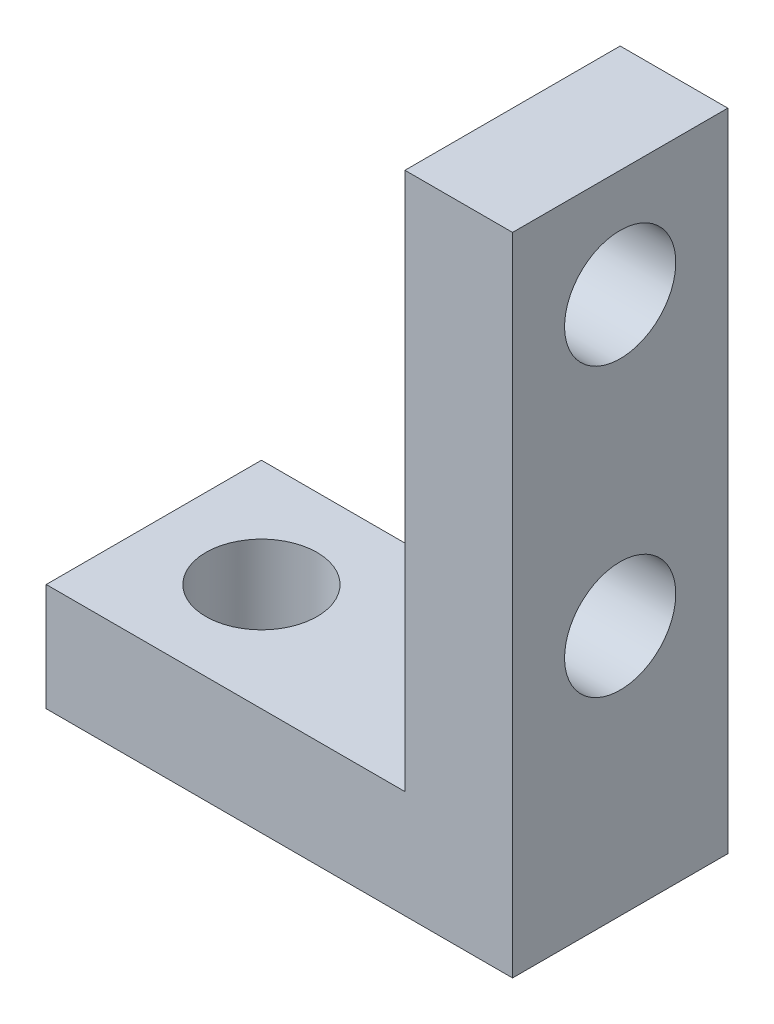
ISO-10303-21;
HEADER;
FILE_DESCRIPTION(('STEP AP214'),'2;1');
FILE_NAME('part.step','',(''),(''),'','','');
FILE_SCHEMA(('AUTOMOTIVE_DESIGN { 1 0 10303 214 1 1 1 1 }'));
ENDSEC;
DATA;
#1=APPLICATION_CONTEXT('core data for automotive mechanical design processes');
#2=APPLICATION_PROTOCOL_DEFINITION('international standard','automotive_design',2000,#1);
#3=PRODUCT_CONTEXT('',#1,'mechanical');
#4=PRODUCT('Part','Part','',(#3));
#5=PRODUCT_RELATED_PRODUCT_CATEGORY('part','',(#4));
#6=PRODUCT_DEFINITION_FORMATION('','',#4);
#7=PRODUCT_DEFINITION_CONTEXT('part definition',#1,'design');
#8=PRODUCT_DEFINITION('design','',#6,#7);
#9=PRODUCT_DEFINITION_SHAPE('','',#8);
#10=(LENGTH_UNIT() NAMED_UNIT(*) SI_UNIT(.MILLI.,.METRE.));
#11=(NAMED_UNIT(*) PLANE_ANGLE_UNIT() SI_UNIT($,.RADIAN.));
#12=(NAMED_UNIT(*) SI_UNIT($,.STERADIAN.) SOLID_ANGLE_UNIT());
#13=UNCERTAINTY_MEASURE_WITH_UNIT(LENGTH_MEASURE(1.E-05),#10,'distance_accuracy_value','');
#14=(GEOMETRIC_REPRESENTATION_CONTEXT(3) GLOBAL_UNCERTAINTY_ASSIGNED_CONTEXT((#13)) GLOBAL_UNIT_ASSIGNED_CONTEXT((#10,
#11,#12)) REPRESENTATION_CONTEXT('',''));
#15=CARTESIAN_POINT('',(0.,0.,0.));
#16=DIRECTION('',(0.,0.,1.));
#17=DIRECTION('',(1.,0.,0.));
#18=AXIS2_PLACEMENT_3D('',#15,#16,#17);
#19=CARTESIAN_POINT('',(0.,9.00000000000001,6.));
#20=DIRECTION('',(0.,-1.,0.));
#21=DIRECTION('',(0.,0.,-1.));
#22=AXIS2_PLACEMENT_3D('',#19,#20,#21);
#23=PLANE('',#22);
#24=DIRECTION('',(-1.,0.,0.));
#25=VECTOR('',#24,1.);
#26=CARTESIAN_POINT('',(0.,9.00000000000001,0.));
#27=LINE('',#26,#25);
#28=CARTESIAN_POINT('',(6.49999999999999,9.00000000000001,0.));
#29=VERTEX_POINT('',#28);
#30=CARTESIAN_POINT('',(3.49999999999999,9.00000000000001,0.));
#31=VERTEX_POINT('',#30);
#32=EDGE_CURVE('E119',#29,#31,#27,.T.);
#33=ORIENTED_EDGE('',*,*,#32,.T.);
#34=DIRECTION('',(0.,0.,-1.));
#35=VECTOR('',#34,1.);
#36=CARTESIAN_POINT('',(3.49999999999999,9.00000000000001,6.));
#37=LINE('',#36,#35);
#38=CARTESIAN_POINT('',(3.49999999999999,9.00000000000001,6.));
#39=VERTEX_POINT('',#38);
#40=EDGE_CURVE('E11',#39,#31,#37,.T.);
#41=ORIENTED_EDGE('',*,*,#40,.F.);
#42=DIRECTION('',(-1.,0.,0.));
#43=VECTOR('',#42,1.);
#44=CARTESIAN_POINT('',(0.,9.00000000000001,6.));
#45=LINE('',#44,#43);
#46=CARTESIAN_POINT('',(6.49999999999999,9.00000000000001,6.));
#47=VERTEX_POINT('',#46);
#48=EDGE_CURVE('E134',#47,#39,#45,.T.);
#49=ORIENTED_EDGE('',*,*,#48,.F.);
#50=DIRECTION('',(0.,0.,-1.));
#51=VECTOR('',#50,1.);
#52=CARTESIAN_POINT('',(6.49999999999999,9.00000000000001,6.));
#53=LINE('',#52,#51);
#54=EDGE_CURVE('E51',#47,#29,#53,.T.);
#55=ORIENTED_EDGE('',*,*,#54,.T.);
#56=EDGE_LOOP('',(#33,#41,#49,#55));
#57=FACE_BOUND('',#56,.T.);
#58=ADVANCED_FACE('F35',(#57),#23,.F.);
#59=CARTESIAN_POINT('',(3.49999999999999,0.,6.));
#60=DIRECTION('',(1.,0.,0.));
#61=DIRECTION('',(0.,1.,0.));
#62=AXIS2_PLACEMENT_3D('',#59,#60,#61);
#63=PLANE('',#62);
#64=CARTESIAN_POINT('',(3.49999999999999,-1.99999999999999,3.));
#65=DIRECTION('',(1.,0.,0.));
#66=DIRECTION('',(0.,1.,0.));
#67=AXIS2_PLACEMENT_3D('',#64,#65,#66);
#68=CIRCLE('',#67,1.55);
#69=CARTESIAN_POINT('',(3.49999999999999,-0.449999999999992,3.));
#70=VERTEX_POINT('',#69);
#71=EDGE_CURVE('E171',#70,#70,#68,.T.);
#72=ORIENTED_EDGE('',*,*,#71,.T.);
#73=EDGE_LOOP('',(#72));
#74=FACE_BOUND('',#73,.T.);
#75=CARTESIAN_POINT('',(3.49999999999999,6.00000000000001,3.));
#76=DIRECTION('',(1.,0.,0.));
#77=DIRECTION('',(0.,1.,0.));
#78=AXIS2_PLACEMENT_3D('',#75,#76,#77);
#79=CIRCLE('',#78,1.55);
#80=CARTESIAN_POINT('',(3.49999999999999,7.55000000000001,3.));
#81=VERTEX_POINT('',#80);
#82=EDGE_CURVE('E122',#81,#81,#79,.T.);
#83=ORIENTED_EDGE('',*,*,#82,.T.);
#84=EDGE_LOOP('',(#83));
#85=FACE_BOUND('',#84,.T.);
#86=DIRECTION('',(0.,-1.,0.));
#87=VECTOR('',#86,1.);
#88=CARTESIAN_POINT('',(3.49999999999999,0.,0.));
#89=LINE('',#88,#87);
#90=CARTESIAN_POINT('',(3.49999999999999,-5.99999999999999,0.));
#91=VERTEX_POINT('',#90);
#92=EDGE_CURVE('E121',#31,#91,#89,.T.);
#93=ORIENTED_EDGE('',*,*,#92,.T.);
#94=DIRECTION('',(0.,0.,-1.));
#95=VECTOR('',#94,1.);
#96=CARTESIAN_POINT('',(3.49999999999999,-5.99999999999999,6.));
#97=LINE('',#96,#95);
#98=CARTESIAN_POINT('',(3.49999999999999,-5.99999999999999,6.));
#99=VERTEX_POINT('',#98);
#100=EDGE_CURVE('E43',#99,#91,#97,.T.);
#101=ORIENTED_EDGE('',*,*,#100,.F.);
#102=DIRECTION('',(0.,-1.,0.));
#103=VECTOR('',#102,1.);
#104=CARTESIAN_POINT('',(3.49999999999999,0.,6.));
#105=LINE('',#104,#103);
#106=EDGE_CURVE('E83',#39,#99,#105,.T.);
#107=ORIENTED_EDGE('',*,*,#106,.F.);
#108=ORIENTED_EDGE('',*,*,#40,.T.);
#109=EDGE_LOOP('',(#93,#101,#107,#108));
#110=FACE_BOUND('',#109,.T.);
#111=ADVANCED_FACE('F140',(#74,#85,#110),#63,.F.);
#112=CARTESIAN_POINT('',(0.,-5.99999999999999,6.));
#113=DIRECTION('',(0.,1.,0.));
#114=DIRECTION('',(-1.,0.,0.));
#115=AXIS2_PLACEMENT_3D('',#112,#113,#114);
#116=PLANE('',#115);
#117=CARTESIAN_POINT('',(-3.50000000000001,-5.99999999999999,3.));
#118=DIRECTION('',(0.,1.,0.));
#119=DIRECTION('',(-1.,0.,0.));
#120=AXIS2_PLACEMENT_3D('',#117,#118,#119);
#121=CIRCLE('',#120,1.55);
#122=CARTESIAN_POINT('',(-5.05000000000001,-5.99999999999999,3.));
#123=VERTEX_POINT('',#122);
#124=EDGE_CURVE('E177',#123,#123,#121,.T.);
#125=ORIENTED_EDGE('',*,*,#124,.F.);
#126=EDGE_LOOP('',(#125));
#127=FACE_BOUND('',#126,.T.);
#128=DIRECTION('',(1.,0.,0.));
#129=VECTOR('',#128,1.);
#130=CARTESIAN_POINT('',(0.,-5.99999999999999,0.));
#131=LINE('',#130,#129);
#132=CARTESIAN_POINT('',(-6.50000000000001,-5.99999999999999,0.));
#133=VERTEX_POINT('',#132);
#134=EDGE_CURVE('E125',#133,#91,#131,.T.);
#135=ORIENTED_EDGE('',*,*,#134,.F.);
#136=DIRECTION('',(0.,0.,-1.));
#137=VECTOR('',#136,1.);
#138=CARTESIAN_POINT('',(-6.50000000000001,-5.99999999999999,6.));
#139=LINE('',#138,#137);
#140=CARTESIAN_POINT('',(-6.50000000000001,-5.99999999999999,6.));
#141=VERTEX_POINT('',#140);
#142=EDGE_CURVE('E111',#141,#133,#139,.T.);
#143=ORIENTED_EDGE('',*,*,#142,.F.);
#144=DIRECTION('',(1.,0.,0.));
#145=VECTOR('',#144,1.);
#146=CARTESIAN_POINT('',(0.,-5.99999999999999,6.));
#147=LINE('',#146,#145);
#148=EDGE_CURVE('E101',#141,#99,#147,.T.);
#149=ORIENTED_EDGE('',*,*,#148,.T.);
#150=ORIENTED_EDGE('',*,*,#100,.T.);
#151=EDGE_LOOP('',(#135,#143,#149,#150));
#152=FACE_BOUND('',#151,.T.);
#153=ADVANCED_FACE('F139',(#127,#152),#116,.T.);
#154=CARTESIAN_POINT('',(-6.50000000000001,0.,6.));
#155=DIRECTION('',(1.,0.,0.));
#156=DIRECTION('',(0.,1.,0.));
#157=AXIS2_PLACEMENT_3D('',#154,#155,#156);
#158=PLANE('',#157);
#159=DIRECTION('',(0.,-1.,0.));
#160=VECTOR('',#159,1.);
#161=CARTESIAN_POINT('',(-6.50000000000001,0.,0.));
#162=LINE('',#161,#160);
#163=CARTESIAN_POINT('',(-6.50000000000001,-8.99999999999999,0.));
#164=VERTEX_POINT('',#163);
#165=EDGE_CURVE('E108',#133,#164,#162,.T.);
#166=ORIENTED_EDGE('',*,*,#165,.T.);
#167=DIRECTION('',(0.,0.,-1.));
#168=VECTOR('',#167,1.);
#169=CARTESIAN_POINT('',(-6.50000000000001,-8.99999999999999,6.));
#170=LINE('',#169,#168);
#171=CARTESIAN_POINT('',(-6.50000000000001,-8.99999999999999,6.));
#172=VERTEX_POINT('',#171);
#173=EDGE_CURVE('E105',#172,#164,#170,.T.);
#174=ORIENTED_EDGE('',*,*,#173,.F.);
#175=DIRECTION('',(0.,-1.,0.));
#176=VECTOR('',#175,1.);
#177=CARTESIAN_POINT('',(-6.50000000000001,0.,6.));
#178=LINE('',#177,#176);
#179=EDGE_CURVE('E94',#141,#172,#178,.T.);
#180=ORIENTED_EDGE('',*,*,#179,.F.);
#181=ORIENTED_EDGE('',*,*,#142,.T.);
#182=EDGE_LOOP('',(#166,#174,#180,#181));
#183=FACE_BOUND('',#182,.T.);
#184=ADVANCED_FACE('F106',(#183),#158,.F.);
#185=CARTESIAN_POINT('',(0.,-8.99999999999999,6.));
#186=DIRECTION('',(0.,-1.,0.));
#187=DIRECTION('',(0.,0.,-1.));
#188=AXIS2_PLACEMENT_3D('',#185,#186,#187);
#189=PLANE('',#188);
#190=CARTESIAN_POINT('',(-3.50000000000001,-8.99999999999999,3.));
#191=DIRECTION('',(0.,-1.,0.));
#192=DIRECTION('',(0.,0.,-1.));
#193=AXIS2_PLACEMENT_3D('',#190,#191,#192);
#194=CIRCLE('',#193,1.55);
#195=CARTESIAN_POINT('',(-3.50000000000001,-8.99999999999999,1.45));
#196=VERTEX_POINT('',#195);
#197=EDGE_CURVE('E180',#196,#196,#194,.T.);
#198=ORIENTED_EDGE('',*,*,#197,.F.);
#199=EDGE_LOOP('',(#198));
#200=FACE_BOUND('',#199,.T.);
#201=DIRECTION('',(-1.,0.,0.));
#202=VECTOR('',#201,1.);
#203=CARTESIAN_POINT('',(0.,-8.99999999999999,0.));
#204=LINE('',#203,#202);
#205=CARTESIAN_POINT('',(6.49999999999999,-8.99999999999999,0.));
#206=VERTEX_POINT('',#205);
#207=EDGE_CURVE('E129',#206,#164,#204,.T.);
#208=ORIENTED_EDGE('',*,*,#207,.F.);
#209=DIRECTION('',(0.,0.,-1.));
#210=VECTOR('',#209,1.);
#211=CARTESIAN_POINT('',(6.49999999999999,-8.99999999999999,6.));
#212=LINE('',#211,#210);
#213=CARTESIAN_POINT('',(6.49999999999999,-8.99999999999999,6.));
#214=VERTEX_POINT('',#213);
#215=EDGE_CURVE('E71',#214,#206,#212,.T.);
#216=ORIENTED_EDGE('',*,*,#215,.F.);
#217=DIRECTION('',(-1.,0.,0.));
#218=VECTOR('',#217,1.);
#219=CARTESIAN_POINT('',(0.,-8.99999999999999,6.));
#220=LINE('',#219,#218);
#221=EDGE_CURVE('E99',#214,#172,#220,.T.);
#222=ORIENTED_EDGE('',*,*,#221,.T.);
#223=ORIENTED_EDGE('',*,*,#173,.T.);
#224=EDGE_LOOP('',(#208,#216,#222,#223));
#225=FACE_BOUND('',#224,.T.);
#226=ADVANCED_FACE('F113',(#200,#225),#189,.T.);
#227=CARTESIAN_POINT('',(6.49999999999999,0.,6.));
#228=DIRECTION('',(1.,0.,0.));
#229=DIRECTION('',(0.,1.,0.));
#230=AXIS2_PLACEMENT_3D('',#227,#228,#229);
#231=PLANE('',#230);
#232=CARTESIAN_POINT('',(6.49999999999999,-1.99999999999999,3.));
#233=DIRECTION('',(1.,0.,0.));
#234=DIRECTION('',(0.,1.,0.));
#235=AXIS2_PLACEMENT_3D('',#232,#233,#234);
#236=CIRCLE('',#235,1.55);
#237=CARTESIAN_POINT('',(6.49999999999999,-0.449999999999991,3.));
#238=VERTEX_POINT('',#237);
#239=EDGE_CURVE('E174',#238,#238,#236,.T.);
#240=ORIENTED_EDGE('',*,*,#239,.F.);
#241=EDGE_LOOP('',(#240));
#242=FACE_BOUND('',#241,.T.);
#243=CARTESIAN_POINT('',(6.49999999999999,6.00000000000001,3.));
#244=DIRECTION('',(1.,0.,0.));
#245=DIRECTION('',(0.,1.,0.));
#246=AXIS2_PLACEMENT_3D('',#243,#244,#245);
#247=CIRCLE('',#246,1.55);
#248=CARTESIAN_POINT('',(6.49999999999999,7.55000000000001,3.));
#249=VERTEX_POINT('',#248);
#250=EDGE_CURVE('E168',#249,#249,#247,.T.);
#251=ORIENTED_EDGE('',*,*,#250,.F.);
#252=EDGE_LOOP('',(#251));
#253=FACE_BOUND('',#252,.T.);
#254=DIRECTION('',(0.,-1.,0.));
#255=VECTOR('',#254,1.);
#256=CARTESIAN_POINT('',(6.49999999999999,0.,0.));
#257=LINE('',#256,#255);
#258=EDGE_CURVE('E131',#29,#206,#257,.T.);
#259=ORIENTED_EDGE('',*,*,#258,.F.);
#260=ORIENTED_EDGE('',*,*,#54,.F.);
#261=DIRECTION('',(0.,-1.,0.));
#262=VECTOR('',#261,1.);
#263=CARTESIAN_POINT('',(6.49999999999999,0.,6.));
#264=LINE('',#263,#262);
#265=EDGE_CURVE('E114',#47,#214,#264,.T.);
#266=ORIENTED_EDGE('',*,*,#265,.T.);
#267=ORIENTED_EDGE('',*,*,#215,.T.);
#268=EDGE_LOOP('',(#259,#260,#266,#267));
#269=FACE_BOUND('',#268,.T.);
#270=ADVANCED_FACE('F144',(#242,#253,#269),#231,.T.);
#271=CARTESIAN_POINT('',(0.,0.,6.));
#272=DIRECTION('',(0.,0.,1.));
#273=DIRECTION('',(1.,0.,0.));
#274=AXIS2_PLACEMENT_3D('',#271,#272,#273);
#275=PLANE('',#274);
#276=ORIENTED_EDGE('',*,*,#48,.T.);
#277=ORIENTED_EDGE('',*,*,#106,.T.);
#278=ORIENTED_EDGE('',*,*,#148,.F.);
#279=ORIENTED_EDGE('',*,*,#179,.T.);
#280=ORIENTED_EDGE('',*,*,#221,.F.);
#281=ORIENTED_EDGE('',*,*,#265,.F.);
#282=EDGE_LOOP('',(#276,#277,#278,#279,#280,#281));
#283=FACE_BOUND('',#282,.T.);
#284=ADVANCED_FACE('F96',(#283),#275,.T.);
#285=CARTESIAN_POINT('',(0.,0.,0.));
#286=DIRECTION('',(0.,0.,1.));
#287=DIRECTION('',(1.,0.,0.));
#288=AXIS2_PLACEMENT_3D('',#285,#286,#287);
#289=PLANE('',#288);
#290=ORIENTED_EDGE('',*,*,#32,.F.);
#291=ORIENTED_EDGE('',*,*,#258,.T.);
#292=ORIENTED_EDGE('',*,*,#207,.T.);
#293=ORIENTED_EDGE('',*,*,#165,.F.);
#294=ORIENTED_EDGE('',*,*,#134,.T.);
#295=ORIENTED_EDGE('',*,*,#92,.F.);
#296=EDGE_LOOP('',(#290,#291,#292,#293,#294,#295));
#297=FACE_BOUND('',#296,.T.);
#298=ADVANCED_FACE('F143',(#297),#289,.F.);
#299=CARTESIAN_POINT('',(-6.50000000000001,6.00000000000001,3.));
#300=DIRECTION('',(1.,0.,0.));
#301=DIRECTION('',(0.,1.,0.));
#302=AXIS2_PLACEMENT_3D('',#299,#300,#301);
#303=CYLINDRICAL_SURFACE('',#302,1.55);
#304=ORIENTED_EDGE('',*,*,#250,.T.);
#305=EDGE_LOOP('',(#304));
#306=FACE_BOUND('',#305,.T.);
#307=ORIENTED_EDGE('',*,*,#82,.F.);
#308=EDGE_LOOP('',(#307));
#309=FACE_BOUND('',#308,.T.);
#310=ADVANCED_FACE('F192',(#306,#309),#303,.F.);
#311=CARTESIAN_POINT('',(-6.50000000000001,-1.99999999999999,3.));
#312=DIRECTION('',(1.,0.,0.));
#313=DIRECTION('',(0.,1.,0.));
#314=AXIS2_PLACEMENT_3D('',#311,#312,#313);
#315=CYLINDRICAL_SURFACE('',#314,1.55);
#316=ORIENTED_EDGE('',*,*,#239,.T.);
#317=EDGE_LOOP('',(#316));
#318=FACE_BOUND('',#317,.T.);
#319=ORIENTED_EDGE('',*,*,#71,.F.);
#320=EDGE_LOOP('',(#319));
#321=FACE_BOUND('',#320,.T.);
#322=ADVANCED_FACE('F186',(#318,#321),#315,.F.);
#323=CARTESIAN_POINT('',(-3.50000000000001,9.00000000000001,3.));
#324=DIRECTION('',(0.,-1.,0.));
#325=DIRECTION('',(0.,0.,-1.));
#326=AXIS2_PLACEMENT_3D('',#323,#324,#325);
#327=CYLINDRICAL_SURFACE('',#326,1.55);
#328=ORIENTED_EDGE('',*,*,#124,.T.);
#329=EDGE_LOOP('',(#328));
#330=FACE_BOUND('',#329,.T.);
#331=ORIENTED_EDGE('',*,*,#197,.T.);
#332=EDGE_LOOP('',(#331));
#333=FACE_BOUND('',#332,.T.);
#334=ADVANCED_FACE('F184',(#330,#333),#327,.F.);
#335=CLOSED_SHELL('',(#58,#111,#153,#184,#226,#270,#284,#298,#310,#322,#334));
#336=MANIFOLD_SOLID_BREP('B2',#335);
#337=ADVANCED_BREP_SHAPE_REPRESENTATION('',(#18,#336),#14);
#338=SHAPE_DEFINITION_REPRESENTATION(#9,#337);
ENDSEC;
END-ISO-10303-21;
